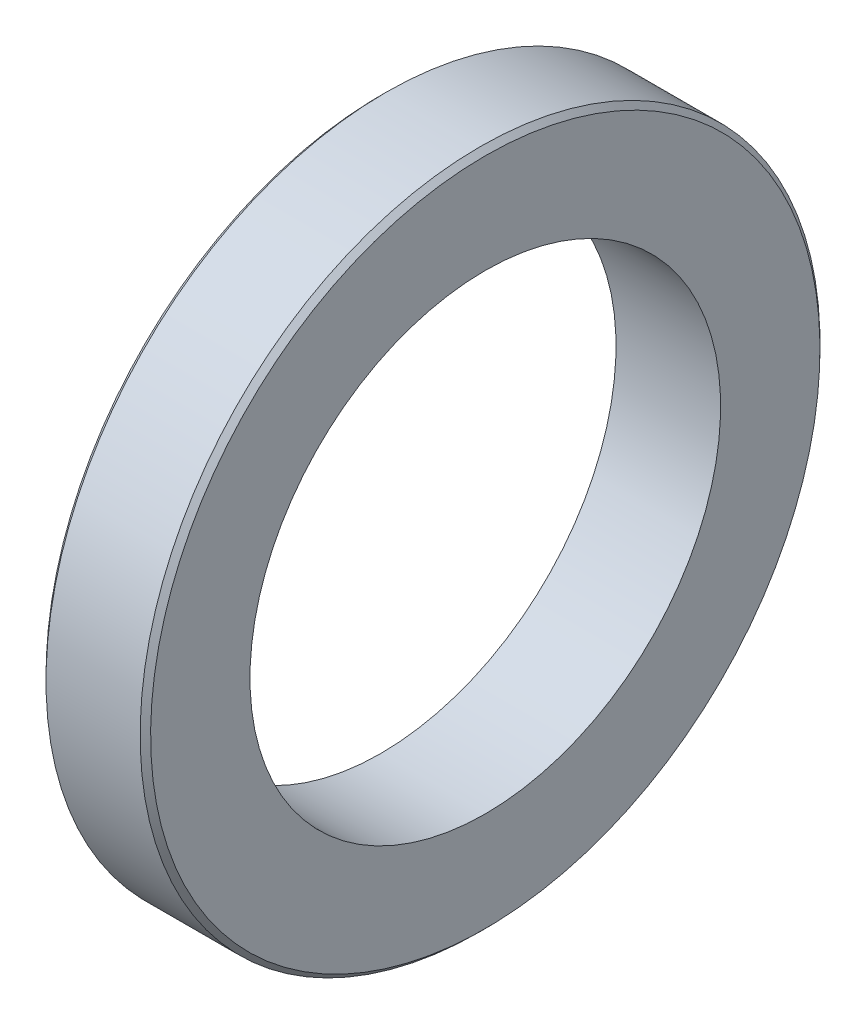
ISO-10303-21;
HEADER;
FILE_DESCRIPTION(('STEP AP214'),'2;1');
FILE_NAME('part.step','',(''),(''),'','','');
FILE_SCHEMA(('AUTOMOTIVE_DESIGN { 1 0 10303 214 1 1 1 1 }'));
ENDSEC;
DATA;
#1=APPLICATION_CONTEXT('core data for automotive mechanical design processes');
#2=APPLICATION_PROTOCOL_DEFINITION('international standard','automotive_design',2000,#1);
#3=PRODUCT_CONTEXT('',#1,'mechanical');
#4=PRODUCT('Part','Part','',(#3));
#5=PRODUCT_RELATED_PRODUCT_CATEGORY('part','',(#4));
#6=PRODUCT_DEFINITION_FORMATION('','',#4);
#7=PRODUCT_DEFINITION_CONTEXT('part definition',#1,'design');
#8=PRODUCT_DEFINITION('design','',#6,#7);
#9=PRODUCT_DEFINITION_SHAPE('','',#8);
#10=(LENGTH_UNIT() NAMED_UNIT(*) SI_UNIT(.MILLI.,.METRE.));
#11=(NAMED_UNIT(*) PLANE_ANGLE_UNIT() SI_UNIT($,.RADIAN.));
#12=(NAMED_UNIT(*) SI_UNIT($,.STERADIAN.) SOLID_ANGLE_UNIT());
#13=UNCERTAINTY_MEASURE_WITH_UNIT(LENGTH_MEASURE(1.E-05),#10,'distance_accuracy_value','');
#14=(GEOMETRIC_REPRESENTATION_CONTEXT(3) GLOBAL_UNCERTAINTY_ASSIGNED_CONTEXT((#13)) GLOBAL_UNIT_ASSIGNED_CONTEXT((#10,
#11,#12)) REPRESENTATION_CONTEXT('',''));
#15=CARTESIAN_POINT('',(0.,0.,0.));
#16=DIRECTION('',(0.,0.,1.));
#17=DIRECTION('',(1.,0.,0.));
#18=AXIS2_PLACEMENT_3D('',#15,#16,#17);
#19=CARTESIAN_POINT('',(5.,-22.5,0.));
#20=DIRECTION('',(1.,0.,0.));
#21=DIRECTION('',(0.,1.,0.));
#22=AXIS2_PLACEMENT_3D('',#19,#20,#21);
#23=PLANE('',#22);
#24=CARTESIAN_POINT('',(5.,0.,0.));
#25=DIRECTION('',(1.,0.,0.));
#26=DIRECTION('',(0.,1.,0.));
#27=AXIS2_PLACEMENT_3D('',#24,#25,#26);
#28=CIRCLE('',#27,32.);
#29=CARTESIAN_POINT('',(4.99999999999999,32.,0.));
#30=VERTEX_POINT('',#29);
#31=EDGE_CURVE('E10',#30,#30,#28,.T.);
#32=ORIENTED_EDGE('',*,*,#31,.T.);
#33=EDGE_LOOP('',(#32));
#34=FACE_BOUND('',#33,.T.);
#35=CARTESIAN_POINT('',(5.,0.,0.));
#36=DIRECTION('',(-1.,0.,0.));
#37=DIRECTION('',(0.,-1.,0.));
#38=AXIS2_PLACEMENT_3D('',#35,#36,#37);
#39=CIRCLE('',#38,22.5);
#40=CARTESIAN_POINT('',(5.,-22.5,0.));
#41=VERTEX_POINT('',#40);
#42=EDGE_CURVE('E70',#41,#41,#39,.T.);
#43=ORIENTED_EDGE('',*,*,#42,.T.);
#44=EDGE_LOOP('',(#43));
#45=FACE_BOUND('',#44,.T.);
#46=ADVANCED_FACE('F45',(#34,#45),#23,.T.);
#47=CARTESIAN_POINT('',(-32.248243559719,0.,0.));
#48=DIRECTION('',(-1.,0.,0.));
#49=DIRECTION('',(0.,-1.,0.));
#50=AXIS2_PLACEMENT_3D('',#47,#48,#49);
#51=CYLINDRICAL_SURFACE('',#50,22.5);
#52=CARTESIAN_POINT('',(-5.,0.,0.));
#53=DIRECTION('',(-1.,0.,0.));
#54=DIRECTION('',(0.,-1.,0.));
#55=AXIS2_PLACEMENT_3D('',#52,#53,#54);
#56=CIRCLE('',#55,22.5);
#57=CARTESIAN_POINT('',(-5.,-22.5,0.));
#58=VERTEX_POINT('',#57);
#59=EDGE_CURVE('E74',#58,#58,#56,.T.);
#60=ORIENTED_EDGE('',*,*,#59,.T.);
#61=EDGE_LOOP('',(#60));
#62=FACE_BOUND('',#61,.T.);
#63=ORIENTED_EDGE('',*,*,#42,.F.);
#64=EDGE_LOOP('',(#63));
#65=FACE_BOUND('',#64,.T.);
#66=ADVANCED_FACE('F79',(#62,#65),#51,.F.);
#67=CARTESIAN_POINT('',(-5.,-22.5,0.));
#68=DIRECTION('',(-1.,0.,0.));
#69=DIRECTION('',(0.,-1.,0.));
#70=AXIS2_PLACEMENT_3D('',#67,#68,#69);
#71=PLANE('',#70);
#72=CARTESIAN_POINT('',(-5.,0.,0.));
#73=DIRECTION('',(-1.,0.,0.));
#74=DIRECTION('',(0.,-1.,0.));
#75=AXIS2_PLACEMENT_3D('',#72,#73,#74);
#76=CIRCLE('',#75,32.);
#77=CARTESIAN_POINT('',(-4.99999999999999,-32.,0.));
#78=VERTEX_POINT('',#77);
#79=EDGE_CURVE('E64',#78,#78,#76,.T.);
#80=ORIENTED_EDGE('',*,*,#79,.T.);
#81=EDGE_LOOP('',(#80));
#82=FACE_BOUND('',#81,.T.);
#83=ORIENTED_EDGE('',*,*,#59,.F.);
#84=EDGE_LOOP('',(#83));
#85=FACE_BOUND('',#84,.T.);
#86=ADVANCED_FACE('F82',(#82,#85),#71,.T.);
#87=CARTESIAN_POINT('',(-32.248243559719,0.,0.));
#88=DIRECTION('',(-1.,0.,0.));
#89=DIRECTION('',(0.,-1.,0.));
#90=AXIS2_PLACEMENT_3D('',#87,#88,#89);
#91=CYLINDRICAL_SURFACE('',#90,32.5);
#92=CARTESIAN_POINT('',(-4.49999999999997,0.,0.));
#93=DIRECTION('',(-1.,0.,0.));
#94=DIRECTION('',(0.,-1.,0.));
#95=AXIS2_PLACEMENT_3D('',#92,#93,#94);
#96=CIRCLE('',#95,32.5);
#97=CARTESIAN_POINT('',(-4.49999999999996,-32.5,0.));
#98=VERTEX_POINT('',#97);
#99=EDGE_CURVE('E54',#98,#98,#96,.F.);
#100=ORIENTED_EDGE('',*,*,#99,.T.);
#101=EDGE_LOOP('',(#100));
#102=FACE_BOUND('',#101,.T.);
#103=CARTESIAN_POINT('',(4.5,0.,0.));
#104=DIRECTION('',(1.,0.,0.));
#105=DIRECTION('',(0.,1.,0.));
#106=AXIS2_PLACEMENT_3D('',#103,#104,#105);
#107=CIRCLE('',#106,32.5);
#108=CARTESIAN_POINT('',(4.49999999999999,32.5,0.));
#109=VERTEX_POINT('',#108);
#110=EDGE_CURVE('E59',#109,#109,#107,.F.);
#111=ORIENTED_EDGE('',*,*,#110,.T.);
#112=EDGE_LOOP('',(#111));
#113=FACE_BOUND('',#112,.T.);
#114=ADVANCED_FACE('F84',(#102,#113),#91,.T.);
#115=CARTESIAN_POINT('',(-5.,0.,0.));
#116=DIRECTION('',(1.,0.,0.));
#117=DIRECTION('',(0.,1.,0.));
#118=AXIS2_PLACEMENT_3D('',#115,#116,#117);
#119=CONICAL_SURFACE('',#118,32.,0.785398163397455);
#120=ORIENTED_EDGE('',*,*,#99,.F.);
#121=EDGE_LOOP('',(#120));
#122=FACE_BOUND('',#121,.T.);
#123=ORIENTED_EDGE('',*,*,#79,.F.);
#124=EDGE_LOOP('',(#123));
#125=FACE_BOUND('',#124,.T.);
#126=ADVANCED_FACE('F91',(#122,#125),#119,.T.);
#127=CARTESIAN_POINT('',(4.5,0.,0.));
#128=DIRECTION('',(-1.,0.,0.));
#129=DIRECTION('',(0.,-1.,0.));
#130=AXIS2_PLACEMENT_3D('',#127,#128,#129);
#131=CONICAL_SURFACE('',#130,32.5,0.785398163397455);
#132=ORIENTED_EDGE('',*,*,#31,.F.);
#133=EDGE_LOOP('',(#132));
#134=FACE_BOUND('',#133,.T.);
#135=ORIENTED_EDGE('',*,*,#110,.F.);
#136=EDGE_LOOP('',(#135));
#137=FACE_BOUND('',#136,.T.);
#138=ADVANCED_FACE('F48',(#134,#137),#131,.T.);
#139=CLOSED_SHELL('',(#46,#66,#86,#114,#126,#138));
#140=MANIFOLD_SOLID_BREP('B2',#139);
#141=ADVANCED_BREP_SHAPE_REPRESENTATION('',(#18,#140),#14);
#142=SHAPE_DEFINITION_REPRESENTATION(#9,#141);
ENDSEC;
END-ISO-10303-21;
